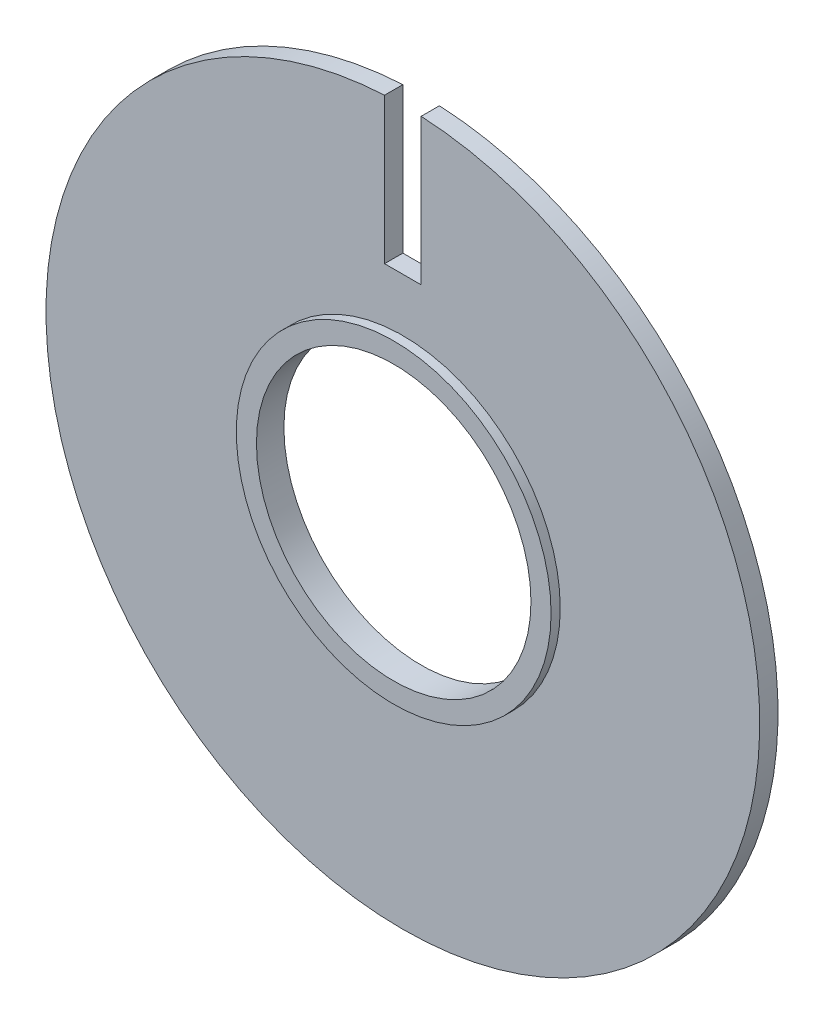
ISO-10303-21;
HEADER;
FILE_DESCRIPTION(('STEP AP214'),'2;1');
FILE_NAME('part.step','',(''),(''),'','','');
FILE_SCHEMA(('AUTOMOTIVE_DESIGN { 1 0 10303 214 1 1 1 1 }'));
ENDSEC;
DATA;
#1=APPLICATION_CONTEXT('core data for automotive mechanical design processes');
#2=APPLICATION_PROTOCOL_DEFINITION('international standard','automotive_design',2000,#1);
#3=PRODUCT_CONTEXT('',#1,'mechanical');
#4=PRODUCT('Part','Part','',(#3));
#5=PRODUCT_RELATED_PRODUCT_CATEGORY('part','',(#4));
#6=PRODUCT_DEFINITION_FORMATION('','',#4);
#7=PRODUCT_DEFINITION_CONTEXT('part definition',#1,'design');
#8=PRODUCT_DEFINITION('design','',#6,#7);
#9=PRODUCT_DEFINITION_SHAPE('','',#8);
#10=(LENGTH_UNIT() NAMED_UNIT(*) SI_UNIT(.MILLI.,.METRE.));
#11=(NAMED_UNIT(*) PLANE_ANGLE_UNIT() SI_UNIT($,.RADIAN.));
#12=(NAMED_UNIT(*) SI_UNIT($,.STERADIAN.) SOLID_ANGLE_UNIT());
#13=UNCERTAINTY_MEASURE_WITH_UNIT(LENGTH_MEASURE(1.E-05),#10,'distance_accuracy_value','');
#14=(GEOMETRIC_REPRESENTATION_CONTEXT(3) GLOBAL_UNCERTAINTY_ASSIGNED_CONTEXT((#13)) GLOBAL_UNIT_ASSIGNED_CONTEXT((#10,
#11,#12)) REPRESENTATION_CONTEXT('',''));
#15=CARTESIAN_POINT('',(0.,0.,0.));
#16=DIRECTION('',(0.,0.,1.));
#17=DIRECTION('',(1.,0.,0.));
#18=AXIS2_PLACEMENT_3D('',#15,#16,#17);
#19=CARTESIAN_POINT('',(0.,0.,1.));
#20=DIRECTION('',(0.,0.,1.));
#21=DIRECTION('',(1.,0.,0.));
#22=AXIS2_PLACEMENT_3D('',#19,#20,#21);
#23=PLANE('',#22);
#24=DIRECTION('',(0.,-1.,0.));
#25=VECTOR('',#24,1.);
#26=CARTESIAN_POINT('',(-1.,19.5,1.));
#27=LINE('',#26,#25);
#28=CARTESIAN_POINT('',(-1.,19.4743420941505,1.));
#29=VERTEX_POINT('',#28);
#30=CARTESIAN_POINT('',(-1.,11.5,1.));
#31=VERTEX_POINT('',#30);
#32=EDGE_CURVE('E58',#29,#31,#27,.T.);
#33=ORIENTED_EDGE('',*,*,#32,.F.);
#34=CARTESIAN_POINT('',(0.,0.,1.));
#35=DIRECTION('',(0.,0.,1.));
#36=DIRECTION('',(1.,0.,0.));
#37=AXIS2_PLACEMENT_3D('',#34,#35,#36);
#38=CIRCLE('',#37,19.5);
#39=CARTESIAN_POINT('',(1.,19.4743420941505,1.));
#40=VERTEX_POINT('',#39);
#41=EDGE_CURVE('E25',#29,#40,#38,.T.);
#42=ORIENTED_EDGE('',*,*,#41,.T.);
#43=DIRECTION('',(0.,1.,0.));
#44=VECTOR('',#43,1.);
#45=CARTESIAN_POINT('',(1.,19.5,1.));
#46=LINE('',#45,#44);
#47=CARTESIAN_POINT('',(1.,11.5,1.));
#48=VERTEX_POINT('',#47);
#49=EDGE_CURVE('E68',#48,#40,#46,.T.);
#50=ORIENTED_EDGE('',*,*,#49,.F.);
#51=DIRECTION('',(1.,0.,0.));
#52=VECTOR('',#51,1.);
#53=CARTESIAN_POINT('',(-1.,11.5,1.));
#54=LINE('',#53,#52);
#55=EDGE_CURVE('E98',#31,#48,#54,.T.);
#56=ORIENTED_EDGE('',*,*,#55,.F.);
#57=EDGE_LOOP('',(#33,#42,#50,#56));
#58=FACE_BOUND('',#57,.T.);
#59=CARTESIAN_POINT('',(0.,0.,1.));
#60=DIRECTION('',(0.,0.,1.));
#61=DIRECTION('',(1.,0.,0.));
#62=AXIS2_PLACEMENT_3D('',#59,#60,#61);
#63=CIRCLE('',#62,8.6);
#64=CARTESIAN_POINT('',(8.6,0.,1.));
#65=VERTEX_POINT('',#64);
#66=EDGE_CURVE('E81',#65,#65,#63,.T.);
#67=ORIENTED_EDGE('',*,*,#66,.F.);
#68=EDGE_LOOP('',(#67));
#69=FACE_BOUND('',#68,.T.);
#70=ADVANCED_FACE('F17',(#58,#69),#23,.T.);
#71=CARTESIAN_POINT('',(0.,0.,1.));
#72=DIRECTION('',(0.,0.,-1.));
#73=DIRECTION('',(-1.,0.,0.));
#74=AXIS2_PLACEMENT_3D('',#71,#72,#73);
#75=CYLINDRICAL_SURFACE('',#74,19.5);
#76=ORIENTED_EDGE('',*,*,#41,.F.);
#77=DIRECTION('',(0.,0.,-1.));
#78=VECTOR('',#77,1.);
#79=CARTESIAN_POINT('',(-1.,19.4743420941505,1.));
#80=LINE('',#79,#78);
#81=CARTESIAN_POINT('',(-1.,19.4743420941505,0.));
#82=VERTEX_POINT('',#81);
#83=EDGE_CURVE('E90',#29,#82,#80,.T.);
#84=ORIENTED_EDGE('',*,*,#83,.T.);
#85=CARTESIAN_POINT('',(0.,0.,0.));
#86=DIRECTION('',(0.,0.,1.));
#87=DIRECTION('',(1.,0.,0.));
#88=AXIS2_PLACEMENT_3D('',#85,#86,#87);
#89=CIRCLE('',#88,19.5);
#90=CARTESIAN_POINT('',(1.,19.4743420941505,0.));
#91=VERTEX_POINT('',#90);
#92=EDGE_CURVE('E74',#82,#91,#89,.T.);
#93=ORIENTED_EDGE('',*,*,#92,.T.);
#94=DIRECTION('',(0.,0.,-1.));
#95=VECTOR('',#94,1.);
#96=CARTESIAN_POINT('',(1.,19.4743420941505,1.));
#97=LINE('',#96,#95);
#98=EDGE_CURVE('E94',#91,#40,#97,.F.);
#99=ORIENTED_EDGE('',*,*,#98,.T.);
#100=EDGE_LOOP('',(#76,#84,#93,#99));
#101=FACE_BOUND('',#100,.T.);
#102=ADVANCED_FACE('F19',(#101),#75,.T.);
#103=CARTESIAN_POINT('',(0.,0.,0.));
#104=DIRECTION('',(0.,0.,1.));
#105=DIRECTION('',(1.,0.,0.));
#106=AXIS2_PLACEMENT_3D('',#103,#104,#105);
#107=PLANE('',#106);
#108=ORIENTED_EDGE('',*,*,#92,.F.);
#109=DIRECTION('',(0.,-1.,0.));
#110=VECTOR('',#109,1.);
#111=CARTESIAN_POINT('',(-1.,0.,0.));
#112=LINE('',#111,#110);
#113=CARTESIAN_POINT('',(-1.,11.5,0.));
#114=VERTEX_POINT('',#113);
#115=EDGE_CURVE('E11',#82,#114,#112,.T.);
#116=ORIENTED_EDGE('',*,*,#115,.T.);
#117=DIRECTION('',(1.,0.,0.));
#118=VECTOR('',#117,1.);
#119=CARTESIAN_POINT('',(-1.,11.5,0.));
#120=LINE('',#119,#118);
#121=CARTESIAN_POINT('',(1.,11.5,0.));
#122=VERTEX_POINT('',#121);
#123=EDGE_CURVE('E65',#114,#122,#120,.T.);
#124=ORIENTED_EDGE('',*,*,#123,.T.);
#125=DIRECTION('',(0.,1.,0.));
#126=VECTOR('',#125,1.);
#127=CARTESIAN_POINT('',(1.,19.5,0.));
#128=LINE('',#127,#126);
#129=EDGE_CURVE('E32',#122,#91,#128,.T.);
#130=ORIENTED_EDGE('',*,*,#129,.T.);
#131=EDGE_LOOP('',(#108,#116,#124,#130));
#132=FACE_BOUND('',#131,.T.);
#133=CARTESIAN_POINT('',(0.,0.,0.));
#134=DIRECTION('',(0.,0.,1.));
#135=DIRECTION('',(1.,0.,0.));
#136=AXIS2_PLACEMENT_3D('',#133,#134,#135);
#137=CIRCLE('',#136,7.5);
#138=CARTESIAN_POINT('',(7.5,0.,0.));
#139=VERTEX_POINT('',#138);
#140=EDGE_CURVE('E85',#139,#139,#137,.T.);
#141=ORIENTED_EDGE('',*,*,#140,.T.);
#142=EDGE_LOOP('',(#141));
#143=FACE_BOUND('',#142,.T.);
#144=ADVANCED_FACE('F71',(#132,#143),#107,.F.);
#145=CARTESIAN_POINT('',(0.,0.,1.5));
#146=DIRECTION('',(0.,0.,-1.));
#147=DIRECTION('',(-1.,0.,0.));
#148=AXIS2_PLACEMENT_3D('',#145,#146,#147);
#149=CYLINDRICAL_SURFACE('',#148,8.6);
#150=CARTESIAN_POINT('',(0.,0.,1.5));
#151=DIRECTION('',(0.,0.,1.));
#152=DIRECTION('',(1.,0.,0.));
#153=AXIS2_PLACEMENT_3D('',#150,#151,#152);
#154=CIRCLE('',#153,8.6);
#155=CARTESIAN_POINT('',(8.6,0.,1.5));
#156=VERTEX_POINT('',#155);
#157=EDGE_CURVE('E77',#156,#156,#154,.T.);
#158=ORIENTED_EDGE('',*,*,#157,.F.);
#159=EDGE_LOOP('',(#158));
#160=FACE_BOUND('',#159,.T.);
#161=ORIENTED_EDGE('',*,*,#66,.T.);
#162=EDGE_LOOP('',(#161));
#163=FACE_BOUND('',#162,.T.);
#164=ADVANCED_FACE('F113',(#160,#163),#149,.T.);
#165=CARTESIAN_POINT('',(0.,0.,1.5));
#166=DIRECTION('',(0.,0.,1.));
#167=DIRECTION('',(1.,0.,0.));
#168=AXIS2_PLACEMENT_3D('',#165,#166,#167);
#169=PLANE('',#168);
#170=CARTESIAN_POINT('',(0.,0.,1.5));
#171=DIRECTION('',(0.,0.,1.));
#172=DIRECTION('',(1.,0.,0.));
#173=AXIS2_PLACEMENT_3D('',#170,#171,#172);
#174=CIRCLE('',#173,7.5);
#175=CARTESIAN_POINT('',(7.5,0.,1.5));
#176=VERTEX_POINT('',#175);
#177=EDGE_CURVE('E87',#176,#176,#174,.T.);
#178=ORIENTED_EDGE('',*,*,#177,.F.);
#179=EDGE_LOOP('',(#178));
#180=FACE_BOUND('',#179,.T.);
#181=ORIENTED_EDGE('',*,*,#157,.T.);
#182=EDGE_LOOP('',(#181));
#183=FACE_BOUND('',#182,.T.);
#184=ADVANCED_FACE('F121',(#180,#183),#169,.T.);
#185=CARTESIAN_POINT('',(0.,0.,0.));
#186=DIRECTION('',(0.,0.,1.));
#187=DIRECTION('',(1.,0.,0.));
#188=AXIS2_PLACEMENT_3D('',#185,#186,#187);
#189=CYLINDRICAL_SURFACE('',#188,7.5);
#190=ORIENTED_EDGE('',*,*,#140,.F.);
#191=EDGE_LOOP('',(#190));
#192=FACE_BOUND('',#191,.T.);
#193=ORIENTED_EDGE('',*,*,#177,.T.);
#194=EDGE_LOOP('',(#193));
#195=FACE_BOUND('',#194,.T.);
#196=ADVANCED_FACE('F125',(#192,#195),#189,.F.);
#197=CARTESIAN_POINT('',(-1.,19.5,0.));
#198=DIRECTION('',(-1.,0.,0.));
#199=DIRECTION('',(0.,-1.,0.));
#200=AXIS2_PLACEMENT_3D('',#197,#198,#199);
#201=PLANE('',#200);
#202=ORIENTED_EDGE('',*,*,#32,.T.);
#203=DIRECTION('',(0.,0.,1.));
#204=VECTOR('',#203,1.);
#205=CARTESIAN_POINT('',(-1.,11.5,0.));
#206=LINE('',#205,#204);
#207=EDGE_CURVE('E54',#114,#31,#206,.T.);
#208=ORIENTED_EDGE('',*,*,#207,.F.);
#209=ORIENTED_EDGE('',*,*,#115,.F.);
#210=ORIENTED_EDGE('',*,*,#83,.F.);
#211=EDGE_LOOP('',(#202,#208,#209,#210));
#212=FACE_BOUND('',#211,.T.);
#213=ADVANCED_FACE('F56',(#212),#201,.F.);
#214=CARTESIAN_POINT('',(1.,19.5,0.));
#215=DIRECTION('',(1.,0.,0.));
#216=DIRECTION('',(0.,1.,0.));
#217=AXIS2_PLACEMENT_3D('',#214,#215,#216);
#218=PLANE('',#217);
#219=ORIENTED_EDGE('',*,*,#129,.F.);
#220=DIRECTION('',(0.,0.,1.));
#221=VECTOR('',#220,1.);
#222=CARTESIAN_POINT('',(1.,11.5,0.));
#223=LINE('',#222,#221);
#224=EDGE_CURVE('E62',#122,#48,#223,.T.);
#225=ORIENTED_EDGE('',*,*,#224,.T.);
#226=ORIENTED_EDGE('',*,*,#49,.T.);
#227=ORIENTED_EDGE('',*,*,#98,.F.);
#228=EDGE_LOOP('',(#219,#225,#226,#227));
#229=FACE_BOUND('',#228,.T.);
#230=ADVANCED_FACE('F105',(#229),#218,.F.);
#231=CARTESIAN_POINT('',(-1.,11.5,0.));
#232=DIRECTION('',(0.,-1.,0.));
#233=DIRECTION('',(0.,0.,-1.));
#234=AXIS2_PLACEMENT_3D('',#231,#232,#233);
#235=PLANE('',#234);
#236=ORIENTED_EDGE('',*,*,#55,.T.);
#237=ORIENTED_EDGE('',*,*,#224,.F.);
#238=ORIENTED_EDGE('',*,*,#123,.F.);
#239=ORIENTED_EDGE('',*,*,#207,.T.);
#240=EDGE_LOOP('',(#236,#237,#238,#239));
#241=FACE_BOUND('',#240,.T.);
#242=ADVANCED_FACE('F66',(#241),#235,.F.);
#243=CLOSED_SHELL('',(#70,#102,#144,#164,#184,#196,#213,#230,#242));
#244=MANIFOLD_SOLID_BREP('B1',#243);
#245=ADVANCED_BREP_SHAPE_REPRESENTATION('',(#18,#244),#14);
#246=SHAPE_DEFINITION_REPRESENTATION(#9,#245);
ENDSEC;
END-ISO-10303-21;
